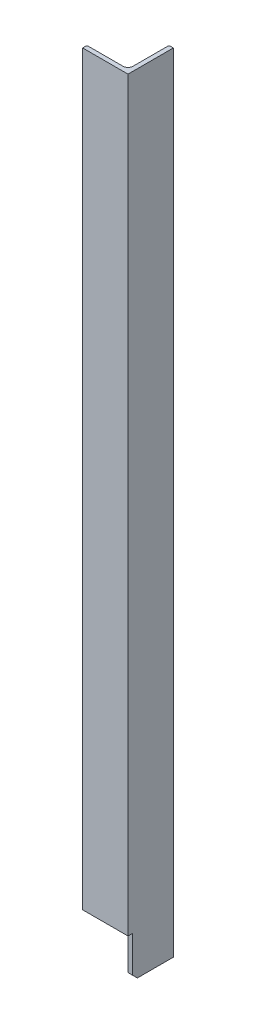
ISO-10303-21;
HEADER;
FILE_DESCRIPTION(('STEP AP214'),'2;1');
FILE_NAME('part.step','',(''),(''),'','','');
FILE_SCHEMA(('AUTOMOTIVE_DESIGN { 1 0 10303 214 1 1 1 1 }'));
ENDSEC;
DATA;
#1=APPLICATION_CONTEXT('core data for automotive mechanical design processes');
#2=APPLICATION_PROTOCOL_DEFINITION('international standard','automotive_design',2000,#1);
#3=PRODUCT_CONTEXT('',#1,'mechanical');
#4=PRODUCT('Part','Part','',(#3));
#5=PRODUCT_RELATED_PRODUCT_CATEGORY('part','',(#4));
#6=PRODUCT_DEFINITION_FORMATION('','',#4);
#7=PRODUCT_DEFINITION_CONTEXT('part definition',#1,'design');
#8=PRODUCT_DEFINITION('design','',#6,#7);
#9=PRODUCT_DEFINITION_SHAPE('','',#8);
#10=(LENGTH_UNIT() NAMED_UNIT(*) SI_UNIT(.MILLI.,.METRE.));
#11=(NAMED_UNIT(*) PLANE_ANGLE_UNIT() SI_UNIT($,.RADIAN.));
#12=(NAMED_UNIT(*) SI_UNIT($,.STERADIAN.) SOLID_ANGLE_UNIT());
#13=UNCERTAINTY_MEASURE_WITH_UNIT(LENGTH_MEASURE(1.E-05),#10,'distance_accuracy_value','');
#14=(GEOMETRIC_REPRESENTATION_CONTEXT(3) GLOBAL_UNCERTAINTY_ASSIGNED_CONTEXT((#13)) GLOBAL_UNIT_ASSIGNED_CONTEXT((#10,
#11,#12)) REPRESENTATION_CONTEXT('',''));
#15=CARTESIAN_POINT('',(0.,0.,0.));
#16=DIRECTION('',(0.,0.,1.));
#17=DIRECTION('',(1.,0.,0.));
#18=AXIS2_PLACEMENT_3D('',#15,#16,#17);
#19=CARTESIAN_POINT('',(737.,0.,487.));
#20=DIRECTION('',(0.,1.,0.));
#21=DIRECTION('',(-1.,0.,0.));
#22=AXIS2_PLACEMENT_3D('',#19,#20,#21);
#23=CYLINDRICAL_SURFACE('',#22,7.00000000000001);
#24=CARTESIAN_POINT('',(737.,63.,487.));
#25=DIRECTION('',(0.,-1.,0.));
#26=DIRECTION('',(0.,0.,-1.));
#27=AXIS2_PLACEMENT_3D('',#24,#25,#26);
#28=CIRCLE('',#27,7.00000000000001);
#29=CARTESIAN_POINT('',(737.,62.9999999999999,493.999999999999));
#30=VERTEX_POINT('',#29);
#31=CARTESIAN_POINT('',(744.,63.,486.999999999999));
#32=VERTEX_POINT('',#31);
#33=EDGE_CURVE('E172',#30,#32,#28,.F.);
#34=ORIENTED_EDGE('',*,*,#33,.F.);
#35=DIRECTION('',(0.,1.,0.));
#36=VECTOR('',#35,1.);
#37=CARTESIAN_POINT('',(737.,0.,494.));
#38=LINE('',#37,#36);
#39=CARTESIAN_POINT('',(737.,1100.,494.));
#40=VERTEX_POINT('',#39);
#41=EDGE_CURVE('E158',#30,#40,#38,.T.);
#42=ORIENTED_EDGE('',*,*,#41,.T.);
#43=CARTESIAN_POINT('',(737.,1100.,487.));
#44=DIRECTION('',(0.,1.,0.));
#45=DIRECTION('',(-1.,0.,0.));
#46=AXIS2_PLACEMENT_3D('',#43,#44,#45);
#47=CIRCLE('',#46,7.00000000000001);
#48=CARTESIAN_POINT('',(744.,1100.,487.));
#49=VERTEX_POINT('',#48);
#50=EDGE_CURVE('E191',#49,#40,#47,.F.);
#51=ORIENTED_EDGE('',*,*,#50,.F.);
#52=DIRECTION('',(0.,1.,0.));
#53=VECTOR('',#52,1.);
#54=CARTESIAN_POINT('',(744.,0.,487.));
#55=LINE('',#54,#53);
#56=EDGE_CURVE('E159',#32,#49,#55,.T.);
#57=ORIENTED_EDGE('',*,*,#56,.F.);
#58=EDGE_LOOP('',(#34,#42,#51,#57));
#59=FACE_BOUND('',#58,.T.);
#60=ADVANCED_FACE('F35',(#59),#23,.F.);
#61=CARTESIAN_POINT('',(750.,0.,437.));
#62=DIRECTION('',(0.,0.,1.));
#63=DIRECTION('',(1.,0.,0.));
#64=AXIS2_PLACEMENT_3D('',#61,#62,#63);
#65=PLANE('',#64);
#66=DIRECTION('',(1.,0.,0.));
#67=VECTOR('',#66,1.);
#68=CARTESIAN_POINT('',(-750.,5.99999999999956,437.));
#69=LINE('',#68,#67);
#70=CARTESIAN_POINT('',(746.3,5.99999999999956,437.));
#71=VERTEX_POINT('',#70);
#72=CARTESIAN_POINT('',(750.,5.99999999999956,437.));
#73=VERTEX_POINT('',#72);
#74=EDGE_CURVE('E43',#71,#73,#69,.T.);
#75=ORIENTED_EDGE('',*,*,#74,.F.);
#76=DIRECTION('',(0.,1.,0.));
#77=VECTOR('',#76,1.);
#78=CARTESIAN_POINT('',(746.3,0.,437.));
#79=LINE('',#78,#77);
#80=CARTESIAN_POINT('',(746.300000000001,1100.,437.));
#81=VERTEX_POINT('',#80);
#82=EDGE_CURVE('E171',#71,#81,#79,.T.);
#83=ORIENTED_EDGE('',*,*,#82,.T.);
#84=DIRECTION('',(-1.,0.,0.));
#85=VECTOR('',#84,1.);
#86=CARTESIAN_POINT('',(750.000000000001,1100.,437.));
#87=LINE('',#86,#85);
#88=CARTESIAN_POINT('',(750.000000000001,1100.,437.));
#89=VERTEX_POINT('',#88);
#90=EDGE_CURVE('E188',#89,#81,#87,.T.);
#91=ORIENTED_EDGE('',*,*,#90,.F.);
#92=DIRECTION('',(0.,1.,0.));
#93=VECTOR('',#92,1.);
#94=CARTESIAN_POINT('',(750.,0.,437.));
#95=LINE('',#94,#93);
#96=EDGE_CURVE('E170',#73,#89,#95,.T.);
#97=ORIENTED_EDGE('',*,*,#96,.F.);
#98=EDGE_LOOP('',(#75,#83,#91,#97));
#99=FACE_BOUND('',#98,.T.);
#100=ADVANCED_FACE('F37',(#99),#65,.F.);
#101=CARTESIAN_POINT('',(750.,0.,437.));
#102=DIRECTION('',(-1.,0.,0.));
#103=DIRECTION('',(0.,0.,1.));
#104=AXIS2_PLACEMENT_3D('',#101,#102,#103);
#105=PLANE('',#104);
#106=DIRECTION('',(0.,0.,1.));
#107=VECTOR('',#106,1.);
#108=CARTESIAN_POINT('',(750.,5.99999999999954,437.));
#109=LINE('',#108,#107);
#110=CARTESIAN_POINT('',(750.,5.99999999999989,487.));
#111=VERTEX_POINT('',#110);
#112=EDGE_CURVE('E133',#73,#111,#109,.T.);
#113=ORIENTED_EDGE('',*,*,#112,.F.);
#114=ORIENTED_EDGE('',*,*,#96,.T.);
#115=DIRECTION('',(0.,0.,-1.));
#116=VECTOR('',#115,1.);
#117=CARTESIAN_POINT('',(750.000000000001,1100.,437.));
#118=LINE('',#117,#116);
#119=CARTESIAN_POINT('',(750.,1100.,500.));
#120=VERTEX_POINT('',#119);
#121=EDGE_CURVE('E163',#120,#89,#118,.T.);
#122=ORIENTED_EDGE('',*,*,#121,.F.);
#123=DIRECTION('',(0.,1.,0.));
#124=VECTOR('',#123,1.);
#125=CARTESIAN_POINT('',(750.,0.,500.));
#126=LINE('',#125,#124);
#127=CARTESIAN_POINT('',(750.,62.9999999999999,500.));
#128=VERTEX_POINT('',#127);
#129=EDGE_CURVE('E153',#128,#120,#126,.T.);
#130=ORIENTED_EDGE('',*,*,#129,.F.);
#131=DIRECTION('',(0.,0.,1.));
#132=VECTOR('',#131,1.);
#133=CARTESIAN_POINT('',(750.,63.0000000000001,437.));
#134=LINE('',#133,#132);
#135=CARTESIAN_POINT('',(750.,62.9999999999999,494.));
#136=VERTEX_POINT('',#135);
#137=EDGE_CURVE('E134',#136,#128,#134,.T.);
#138=ORIENTED_EDGE('',*,*,#137,.F.);
#139=DIRECTION('',(0.,1.,0.));
#140=VECTOR('',#139,1.);
#141=CARTESIAN_POINT('',(750.,4.06621745257254E-13,494.));
#142=LINE('',#141,#140);
#143=CARTESIAN_POINT('',(750.,12.9999999999999,494.));
#144=VERTEX_POINT('',#143);
#145=EDGE_CURVE('E147',#144,#136,#142,.T.);
#146=ORIENTED_EDGE('',*,*,#145,.F.);
#147=DIRECTION('',(0.,-0.707106781186548,-0.707106781186547));
#148=VECTOR('',#147,1.);
#149=CARTESIAN_POINT('',(750.,-22.,459.));
#150=LINE('',#149,#148);
#151=EDGE_CURVE('E154',#144,#111,#150,.T.);
#152=ORIENTED_EDGE('',*,*,#151,.T.);
#153=EDGE_LOOP('',(#113,#114,#122,#130,#138,#146,#152));
#154=FACE_BOUND('',#153,.T.);
#155=ADVANCED_FACE('F234',(#154),#105,.F.);
#156=CARTESIAN_POINT('',(750.,0.,500.));
#157=DIRECTION('',(0.,0.,-1.));
#158=DIRECTION('',(-1.,0.,0.));
#159=AXIS2_PLACEMENT_3D('',#156,#157,#158);
#160=PLANE('',#159);
#161=DIRECTION('',(1.,0.,0.));
#162=VECTOR('',#161,1.);
#163=CARTESIAN_POINT('',(-750.,62.9999999999999,500.));
#164=LINE('',#163,#162);
#165=CARTESIAN_POINT('',(687.,62.9999999999999,500.));
#166=VERTEX_POINT('',#165);
#167=EDGE_CURVE('E150',#166,#128,#164,.T.);
#168=ORIENTED_EDGE('',*,*,#167,.T.);
#169=ORIENTED_EDGE('',*,*,#129,.T.);
#170=DIRECTION('',(1.,0.,0.));
#171=VECTOR('',#170,1.);
#172=CARTESIAN_POINT('',(750.,1100.,500.));
#173=LINE('',#172,#171);
#174=CARTESIAN_POINT('',(687.,1100.,500.));
#175=VERTEX_POINT('',#174);
#176=EDGE_CURVE('E203',#175,#120,#173,.T.);
#177=ORIENTED_EDGE('',*,*,#176,.F.);
#178=DIRECTION('',(0.,1.,0.));
#179=VECTOR('',#178,1.);
#180=CARTESIAN_POINT('',(687.,0.,499.999999999999));
#181=LINE('',#180,#179);
#182=EDGE_CURVE('E167',#166,#175,#181,.T.);
#183=ORIENTED_EDGE('',*,*,#182,.F.);
#184=EDGE_LOOP('',(#168,#169,#177,#183));
#185=FACE_BOUND('',#184,.T.);
#186=ADVANCED_FACE('F239',(#185),#160,.F.);
#187=CARTESIAN_POINT('',(687.,0.,496.299999999999));
#188=DIRECTION('',(1.,0.,0.));
#189=DIRECTION('',(0.,0.,-1.));
#190=AXIS2_PLACEMENT_3D('',#187,#188,#189);
#191=PLANE('',#190);
#192=DIRECTION('',(0.,0.,-1.));
#193=VECTOR('',#192,1.);
#194=CARTESIAN_POINT('',(687.,62.9999999999999,496.3));
#195=LINE('',#194,#193);
#196=CARTESIAN_POINT('',(687.,62.9999999999999,496.299999999999));
#197=VERTEX_POINT('',#196);
#198=EDGE_CURVE('E214',#166,#197,#195,.T.);
#199=ORIENTED_EDGE('',*,*,#198,.F.);
#200=ORIENTED_EDGE('',*,*,#182,.T.);
#201=DIRECTION('',(0.,0.,1.));
#202=VECTOR('',#201,1.);
#203=CARTESIAN_POINT('',(687.,1100.,496.299999999999));
#204=LINE('',#203,#202);
#205=CARTESIAN_POINT('',(687.,1100.,496.3));
#206=VERTEX_POINT('',#205);
#207=EDGE_CURVE('E200',#206,#175,#204,.T.);
#208=ORIENTED_EDGE('',*,*,#207,.F.);
#209=DIRECTION('',(0.,1.,0.));
#210=VECTOR('',#209,1.);
#211=CARTESIAN_POINT('',(687.,0.,496.299999999999));
#212=LINE('',#211,#210);
#213=EDGE_CURVE('E165',#197,#206,#212,.T.);
#214=ORIENTED_EDGE('',*,*,#213,.F.);
#215=EDGE_LOOP('',(#199,#200,#208,#214));
#216=FACE_BOUND('',#215,.T.);
#217=ADVANCED_FACE('F243',(#216),#191,.F.);
#218=CARTESIAN_POINT('',(689.3,0.,496.299999999999));
#219=DIRECTION('',(0.,1.,0.));
#220=DIRECTION('',(-1.,0.,0.));
#221=AXIS2_PLACEMENT_3D('',#218,#219,#220);
#222=CYLINDRICAL_SURFACE('',#221,2.29999999999997);
#223=CARTESIAN_POINT('',(689.3,62.9999999999999,496.299999999999));
#224=DIRECTION('',(0.,-1.,0.));
#225=DIRECTION('',(0.,0.,-1.));
#226=AXIS2_PLACEMENT_3D('',#223,#224,#225);
#227=CIRCLE('',#226,2.29999999999997);
#228=CARTESIAN_POINT('',(689.299999999999,62.9999999999999,494.));
#229=VERTEX_POINT('',#228);
#230=EDGE_CURVE('E215',#197,#229,#227,.T.);
#231=ORIENTED_EDGE('',*,*,#230,.F.);
#232=ORIENTED_EDGE('',*,*,#213,.T.);
#233=CARTESIAN_POINT('',(689.3,1100.,496.3));
#234=DIRECTION('',(0.,1.,0.));
#235=DIRECTION('',(-1.,0.,0.));
#236=AXIS2_PLACEMENT_3D('',#233,#234,#235);
#237=CIRCLE('',#236,2.29999999999997);
#238=CARTESIAN_POINT('',(689.3,1100.,494.));
#239=VERTEX_POINT('',#238);
#240=EDGE_CURVE('E197',#239,#206,#237,.T.);
#241=ORIENTED_EDGE('',*,*,#240,.F.);
#242=DIRECTION('',(0.,1.,0.));
#243=VECTOR('',#242,1.);
#244=CARTESIAN_POINT('',(689.3,0.,494.));
#245=LINE('',#244,#243);
#246=EDGE_CURVE('E161',#229,#239,#245,.T.);
#247=ORIENTED_EDGE('',*,*,#246,.F.);
#248=EDGE_LOOP('',(#231,#232,#241,#247));
#249=FACE_BOUND('',#248,.T.);
#250=ADVANCED_FACE('F246',(#249),#222,.T.);
#251=CARTESIAN_POINT('',(737.,0.,494.));
#252=DIRECTION('',(0.,0.,1.));
#253=DIRECTION('',(1.,0.,0.));
#254=AXIS2_PLACEMENT_3D('',#251,#252,#253);
#255=PLANE('',#254);
#256=DIRECTION('',(1.,0.,0.));
#257=VECTOR('',#256,1.);
#258=CARTESIAN_POINT('',(-750.,62.9999999999999,494.));
#259=LINE('',#258,#257);
#260=EDGE_CURVE('E156',#229,#30,#259,.T.);
#261=ORIENTED_EDGE('',*,*,#260,.F.);
#262=ORIENTED_EDGE('',*,*,#246,.T.);
#263=DIRECTION('',(-1.,0.,0.));
#264=VECTOR('',#263,1.);
#265=CARTESIAN_POINT('',(737.,1100.,494.));
#266=LINE('',#265,#264);
#267=EDGE_CURVE('E194',#40,#239,#266,.T.);
#268=ORIENTED_EDGE('',*,*,#267,.F.);
#269=ORIENTED_EDGE('',*,*,#41,.F.);
#270=EDGE_LOOP('',(#261,#262,#268,#269));
#271=FACE_BOUND('',#270,.T.);
#272=ADVANCED_FACE('F223',(#271),#255,.F.);
#273=CARTESIAN_POINT('',(744.,0.,439.3));
#274=DIRECTION('',(1.,0.,0.));
#275=DIRECTION('',(0.,0.,-1.));
#276=AXIS2_PLACEMENT_3D('',#273,#274,#275);
#277=PLANE('',#276);
#278=DIRECTION('',(0.,0.,-1.));
#279=VECTOR('',#278,1.);
#280=CARTESIAN_POINT('',(744.,5.99999999999956,439.3));
#281=LINE('',#280,#279);
#282=CARTESIAN_POINT('',(744.,5.99999999999996,487.));
#283=VERTEX_POINT('',#282);
#284=CARTESIAN_POINT('',(744.,5.99999999999954,439.3));
#285=VERTEX_POINT('',#284);
#286=EDGE_CURVE('E131',#283,#285,#281,.T.);
#287=ORIENTED_EDGE('',*,*,#286,.F.);
#288=DIRECTION('',(0.,-0.707106781186548,-0.707106781186547));
#289=VECTOR('',#288,1.);
#290=CARTESIAN_POINT('',(744.,5.99999999999989,487.));
#291=LINE('',#290,#289);
#292=CARTESIAN_POINT('',(744.,12.9999999999998,494.));
#293=VERTEX_POINT('',#292);
#294=EDGE_CURVE('E11',#293,#283,#291,.T.);
#295=ORIENTED_EDGE('',*,*,#294,.F.);
#296=DIRECTION('',(0.,-1.,0.));
#297=VECTOR('',#296,1.);
#298=CARTESIAN_POINT('',(744.,72.8994949366119,493.999999999999));
#299=LINE('',#298,#297);
#300=CARTESIAN_POINT('',(744.,62.9999999999999,494.));
#301=VERTEX_POINT('',#300);
#302=EDGE_CURVE('E50',#301,#293,#299,.T.);
#303=ORIENTED_EDGE('',*,*,#302,.F.);
#304=DIRECTION('',(0.,0.,-1.));
#305=VECTOR('',#304,1.);
#306=CARTESIAN_POINT('',(744.,63.,486.999999999999));
#307=LINE('',#306,#305);
#308=EDGE_CURVE('E177',#301,#32,#307,.T.);
#309=ORIENTED_EDGE('',*,*,#308,.T.);
#310=ORIENTED_EDGE('',*,*,#56,.T.);
#311=DIRECTION('',(0.,0.,1.));
#312=VECTOR('',#311,1.);
#313=CARTESIAN_POINT('',(744.000000000001,1100.,439.3));
#314=LINE('',#313,#312);
#315=CARTESIAN_POINT('',(744.000000000001,1100.,439.3));
#316=VERTEX_POINT('',#315);
#317=EDGE_CURVE('E187',#316,#49,#314,.T.);
#318=ORIENTED_EDGE('',*,*,#317,.F.);
#319=DIRECTION('',(0.,1.,0.));
#320=VECTOR('',#319,1.);
#321=CARTESIAN_POINT('',(744.,0.,439.3));
#322=LINE('',#321,#320);
#323=EDGE_CURVE('E139',#285,#316,#322,.T.);
#324=ORIENTED_EDGE('',*,*,#323,.F.);
#325=EDGE_LOOP('',(#287,#295,#303,#309,#310,#318,#324));
#326=FACE_BOUND('',#325,.T.);
#327=ADVANCED_FACE('F137',(#326),#277,.F.);
#328=CARTESIAN_POINT('',(746.3,0.,439.3));
#329=DIRECTION('',(0.,1.,0.));
#330=DIRECTION('',(-1.,0.,0.));
#331=AXIS2_PLACEMENT_3D('',#328,#329,#330);
#332=CYLINDRICAL_SURFACE('',#331,2.3);
#333=CARTESIAN_POINT('',(746.3,5.99999999999956,439.3));
#334=DIRECTION('',(0.,-1.,0.));
#335=DIRECTION('',(0.,0.,-1.));
#336=AXIS2_PLACEMENT_3D('',#333,#334,#335);
#337=CIRCLE('',#336,2.3);
#338=EDGE_CURVE('E140',#285,#71,#337,.T.);
#339=ORIENTED_EDGE('',*,*,#338,.F.);
#340=ORIENTED_EDGE('',*,*,#323,.T.);
#341=CARTESIAN_POINT('',(746.300000000001,1100.,439.3));
#342=DIRECTION('',(0.,1.,0.));
#343=DIRECTION('',(-1.,0.,0.));
#344=AXIS2_PLACEMENT_3D('',#341,#342,#343);
#345=CIRCLE('',#344,2.3);
#346=EDGE_CURVE('E184',#81,#316,#345,.T.);
#347=ORIENTED_EDGE('',*,*,#346,.F.);
#348=ORIENTED_EDGE('',*,*,#82,.F.);
#349=EDGE_LOOP('',(#339,#340,#347,#348));
#350=FACE_BOUND('',#349,.T.);
#351=ADVANCED_FACE('F251',(#350),#332,.T.);
#352=CARTESIAN_POINT('',(687.,1100.,500.));
#353=DIRECTION('',(0.,1.,0.));
#354=DIRECTION('',(-1.,0.,0.));
#355=AXIS2_PLACEMENT_3D('',#352,#353,#354);
#356=PLANE('',#355);
#357=ORIENTED_EDGE('',*,*,#121,.T.);
#358=ORIENTED_EDGE('',*,*,#90,.T.);
#359=ORIENTED_EDGE('',*,*,#346,.T.);
#360=ORIENTED_EDGE('',*,*,#317,.T.);
#361=ORIENTED_EDGE('',*,*,#50,.T.);
#362=ORIENTED_EDGE('',*,*,#267,.T.);
#363=ORIENTED_EDGE('',*,*,#240,.T.);
#364=ORIENTED_EDGE('',*,*,#207,.T.);
#365=ORIENTED_EDGE('',*,*,#176,.T.);
#366=EDGE_LOOP('',(#357,#358,#359,#360,#361,#362,#363,#364,#365));
#367=FACE_BOUND('',#366,.T.);
#368=ADVANCED_FACE('F249',(#367),#356,.T.);
#369=CARTESIAN_POINT('',(-750.,12.9999999999999,494.));
#370=DIRECTION('',(0.,0.,1.));
#371=DIRECTION('',(0.,-1.,0.));
#372=AXIS2_PLACEMENT_3D('',#369,#370,#371);
#373=PLANE('',#372);
#374=ORIENTED_EDGE('',*,*,#302,.T.);
#375=DIRECTION('',(1.,0.,0.));
#376=VECTOR('',#375,1.);
#377=CARTESIAN_POINT('',(-750.,12.9999999999999,494.));
#378=LINE('',#377,#376);
#379=EDGE_CURVE('E128',#293,#144,#378,.T.);
#380=ORIENTED_EDGE('',*,*,#379,.T.);
#381=ORIENTED_EDGE('',*,*,#145,.T.);
#382=EDGE_CURVE('E143',#301,#136,#259,.T.);
#383=ORIENTED_EDGE('',*,*,#382,.F.);
#384=EDGE_LOOP('',(#374,#380,#381,#383));
#385=FACE_BOUND('',#384,.T.);
#386=ADVANCED_FACE('F229',(#385),#373,.T.);
#387=CARTESIAN_POINT('',(-750.,5.99999999999989,487.));
#388=DIRECTION('',(0.,0.707106781186547,-0.707106781186548));
#389=DIRECTION('',(0.,0.707106781186548,0.707106781186547));
#390=AXIS2_PLACEMENT_3D('',#387,#388,#389);
#391=PLANE('',#390);
#392=ORIENTED_EDGE('',*,*,#379,.F.);
#393=ORIENTED_EDGE('',*,*,#294,.T.);
#394=DIRECTION('',(1.,0.,0.));
#395=VECTOR('',#394,1.);
#396=CARTESIAN_POINT('',(-750.,5.99999999999989,487.));
#397=LINE('',#396,#395);
#398=EDGE_CURVE('E126',#283,#111,#397,.T.);
#399=ORIENTED_EDGE('',*,*,#398,.T.);
#400=ORIENTED_EDGE('',*,*,#151,.F.);
#401=EDGE_LOOP('',(#392,#393,#399,#400));
#402=FACE_BOUND('',#401,.T.);
#403=ADVANCED_FACE('F124',(#402),#391,.F.);
#404=CARTESIAN_POINT('',(-750.,62.9999999999999,496.3));
#405=DIRECTION('',(0.,-1.,0.));
#406=DIRECTION('',(0.,0.,-1.));
#407=AXIS2_PLACEMENT_3D('',#404,#405,#406);
#408=PLANE('',#407);
#409=ORIENTED_EDGE('',*,*,#137,.T.);
#410=ORIENTED_EDGE('',*,*,#167,.F.);
#411=ORIENTED_EDGE('',*,*,#198,.T.);
#412=ORIENTED_EDGE('',*,*,#230,.T.);
#413=ORIENTED_EDGE('',*,*,#260,.T.);
#414=ORIENTED_EDGE('',*,*,#33,.T.);
#415=ORIENTED_EDGE('',*,*,#308,.F.);
#416=ORIENTED_EDGE('',*,*,#382,.T.);
#417=EDGE_LOOP('',(#409,#410,#411,#412,#413,#414,#415,#416));
#418=FACE_BOUND('',#417,.T.);
#419=ADVANCED_FACE('F219',(#418),#408,.T.);
#420=CARTESIAN_POINT('',(-750.,5.99999999999956,439.3));
#421=DIRECTION('',(0.,-1.,0.));
#422=DIRECTION('',(0.,0.,-1.));
#423=AXIS2_PLACEMENT_3D('',#420,#421,#422);
#424=PLANE('',#423);
#425=ORIENTED_EDGE('',*,*,#112,.T.);
#426=ORIENTED_EDGE('',*,*,#398,.F.);
#427=ORIENTED_EDGE('',*,*,#286,.T.);
#428=ORIENTED_EDGE('',*,*,#338,.T.);
#429=ORIENTED_EDGE('',*,*,#74,.T.);
#430=EDGE_LOOP('',(#425,#426,#427,#428,#429));
#431=FACE_BOUND('',#430,.T.);
#432=ADVANCED_FACE('F130',(#431),#424,.T.);
#433=CLOSED_SHELL('',(#60,#100,#155,#186,#217,#250,#272,#327,#351,#368,#386,#403,#419,#432));
#434=MANIFOLD_SOLID_BREP('B2',#433);
#435=ADVANCED_BREP_SHAPE_REPRESENTATION('',(#18,#434),#14);
#436=SHAPE_DEFINITION_REPRESENTATION(#9,#435);
ENDSEC;
END-ISO-10303-21;
